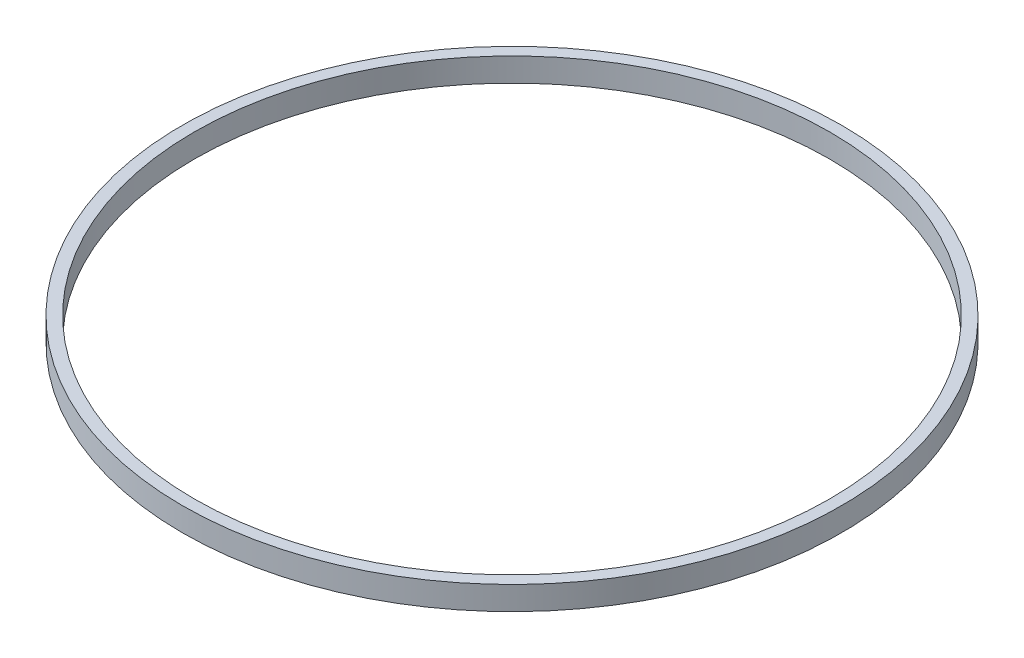
ISO-10303-21;
HEADER;
FILE_DESCRIPTION(('STEP AP214'),'2;1');
FILE_NAME('part.step','',(''),(''),'','','');
FILE_SCHEMA(('AUTOMOTIVE_DESIGN { 1 0 10303 214 1 1 1 1 }'));
ENDSEC;
DATA;
#1=APPLICATION_CONTEXT('core data for automotive mechanical design processes');
#2=APPLICATION_PROTOCOL_DEFINITION('international standard','automotive_design',2000,#1);
#3=PRODUCT_CONTEXT('',#1,'mechanical');
#4=PRODUCT('Part','Part','',(#3));
#5=PRODUCT_RELATED_PRODUCT_CATEGORY('part','',(#4));
#6=PRODUCT_DEFINITION_FORMATION('','',#4);
#7=PRODUCT_DEFINITION_CONTEXT('part definition',#1,'design');
#8=PRODUCT_DEFINITION('design','',#6,#7);
#9=PRODUCT_DEFINITION_SHAPE('','',#8);
#10=(LENGTH_UNIT() NAMED_UNIT(*) SI_UNIT(.MILLI.,.METRE.));
#11=(NAMED_UNIT(*) PLANE_ANGLE_UNIT() SI_UNIT($,.RADIAN.));
#12=(NAMED_UNIT(*) SI_UNIT($,.STERADIAN.) SOLID_ANGLE_UNIT());
#13=UNCERTAINTY_MEASURE_WITH_UNIT(LENGTH_MEASURE(1.E-05),#10,'distance_accuracy_value','');
#14=(GEOMETRIC_REPRESENTATION_CONTEXT(3) GLOBAL_UNCERTAINTY_ASSIGNED_CONTEXT((#13)) GLOBAL_UNIT_ASSIGNED_CONTEXT((#10,
#11,#12)) REPRESENTATION_CONTEXT('',''));
#15=CARTESIAN_POINT('',(0.,0.,0.));
#16=DIRECTION('',(0.,0.,1.));
#17=DIRECTION('',(1.,0.,0.));
#18=AXIS2_PLACEMENT_3D('',#15,#16,#17);
#19=CARTESIAN_POINT('',(0.,2.5,0.));
#20=DIRECTION('',(0.,1.,0.));
#21=DIRECTION('',(0.,0.,1.));
#22=AXIS2_PLACEMENT_3D('',#19,#20,#21);
#23=PLANE('',#22);
#24=CARTESIAN_POINT('',(0.,2.5,0.));
#25=DIRECTION('',(0.,1.,0.));
#26=DIRECTION('',(0.,0.,1.));
#27=AXIS2_PLACEMENT_3D('',#24,#25,#26);
#28=CIRCLE('',#27,70.);
#29=CARTESIAN_POINT('',(0.,2.5,70.));
#30=VERTEX_POINT('',#29);
#31=EDGE_CURVE('E10',#30,#30,#28,.T.);
#32=ORIENTED_EDGE('',*,*,#31,.T.);
#33=EDGE_LOOP('',(#32));
#34=FACE_BOUND('',#33,.T.);
#35=CARTESIAN_POINT('',(0.,2.5,0.));
#36=DIRECTION('',(0.,1.,0.));
#37=DIRECTION('',(0.,0.,1.));
#38=AXIS2_PLACEMENT_3D('',#35,#36,#37);
#39=CIRCLE('',#38,67.5);
#40=CARTESIAN_POINT('',(0.,2.5,67.5));
#41=VERTEX_POINT('',#40);
#42=EDGE_CURVE('E42',#41,#41,#39,.T.);
#43=ORIENTED_EDGE('',*,*,#42,.F.);
#44=EDGE_LOOP('',(#43));
#45=FACE_BOUND('',#44,.T.);
#46=ADVANCED_FACE('F31',(#34,#45),#23,.T.);
#47=CARTESIAN_POINT('',(0.,-2.5,0.));
#48=DIRECTION('',(0.,1.,0.));
#49=DIRECTION('',(0.,0.,1.));
#50=AXIS2_PLACEMENT_3D('',#47,#48,#49);
#51=PLANE('',#50);
#52=CARTESIAN_POINT('',(0.,-2.5,0.));
#53=DIRECTION('',(0.,1.,0.));
#54=DIRECTION('',(0.,0.,1.));
#55=AXIS2_PLACEMENT_3D('',#52,#53,#54);
#56=CIRCLE('',#55,70.);
#57=CARTESIAN_POINT('',(0.,-2.5,70.));
#58=VERTEX_POINT('',#57);
#59=EDGE_CURVE('E35',#58,#58,#56,.T.);
#60=ORIENTED_EDGE('',*,*,#59,.F.);
#61=EDGE_LOOP('',(#60));
#62=FACE_BOUND('',#61,.T.);
#63=CARTESIAN_POINT('',(0.,-2.5,0.));
#64=DIRECTION('',(0.,1.,0.));
#65=DIRECTION('',(0.,0.,1.));
#66=AXIS2_PLACEMENT_3D('',#63,#64,#65);
#67=CIRCLE('',#66,67.5);
#68=CARTESIAN_POINT('',(0.,-2.5,67.5));
#69=VERTEX_POINT('',#68);
#70=EDGE_CURVE('E44',#69,#69,#67,.T.);
#71=ORIENTED_EDGE('',*,*,#70,.T.);
#72=EDGE_LOOP('',(#71));
#73=FACE_BOUND('',#72,.T.);
#74=ADVANCED_FACE('F54',(#62,#73),#51,.F.);
#75=CARTESIAN_POINT('',(0.,2.5,0.));
#76=DIRECTION('',(0.,-1.,0.));
#77=DIRECTION('',(0.,0.,-1.));
#78=AXIS2_PLACEMENT_3D('',#75,#76,#77);
#79=CYLINDRICAL_SURFACE('',#78,70.);
#80=ORIENTED_EDGE('',*,*,#31,.F.);
#81=EDGE_LOOP('',(#80));
#82=FACE_BOUND('',#81,.T.);
#83=ORIENTED_EDGE('',*,*,#59,.T.);
#84=EDGE_LOOP('',(#83));
#85=FACE_BOUND('',#84,.T.);
#86=ADVANCED_FACE('F33',(#82,#85),#79,.T.);
#87=CARTESIAN_POINT('',(0.,2.5,0.));
#88=DIRECTION('',(0.,-1.,0.));
#89=DIRECTION('',(0.,0.,-1.));
#90=AXIS2_PLACEMENT_3D('',#87,#88,#89);
#91=CYLINDRICAL_SURFACE('',#90,67.5);
#92=ORIENTED_EDGE('',*,*,#42,.T.);
#93=EDGE_LOOP('',(#92));
#94=FACE_BOUND('',#93,.T.);
#95=ORIENTED_EDGE('',*,*,#70,.F.);
#96=EDGE_LOOP('',(#95));
#97=FACE_BOUND('',#96,.T.);
#98=ADVANCED_FACE('F50',(#94,#97),#91,.F.);
#99=CLOSED_SHELL('',(#46,#74,#86,#98));
#100=MANIFOLD_SOLID_BREP('B2',#99);
#101=ADVANCED_BREP_SHAPE_REPRESENTATION('',(#18,#100),#14);
#102=SHAPE_DEFINITION_REPRESENTATION(#9,#101);
ENDSEC;
END-ISO-10303-21;
